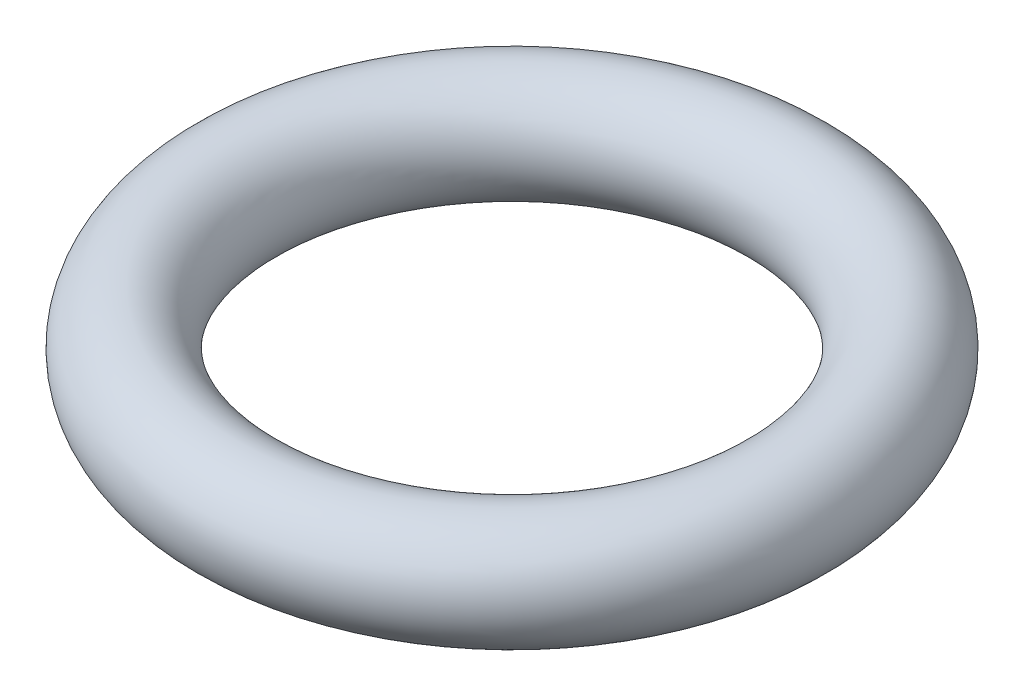
ISO-10303-21;
HEADER;
FILE_DESCRIPTION(('STEP AP214'),'2;1');
FILE_NAME('part.step','',(''),(''),'','','');
FILE_SCHEMA(('AUTOMOTIVE_DESIGN { 1 0 10303 214 1 1 1 1 }'));
ENDSEC;
DATA;
#1=APPLICATION_CONTEXT('core data for automotive mechanical design processes');
#2=APPLICATION_PROTOCOL_DEFINITION('international standard','automotive_design',2000,#1);
#3=PRODUCT_CONTEXT('',#1,'mechanical');
#4=PRODUCT('Part','Part','',(#3));
#5=PRODUCT_RELATED_PRODUCT_CATEGORY('part','',(#4));
#6=PRODUCT_DEFINITION_FORMATION('','',#4);
#7=PRODUCT_DEFINITION_CONTEXT('part definition',#1,'design');
#8=PRODUCT_DEFINITION('design','',#6,#7);
#9=PRODUCT_DEFINITION_SHAPE('','',#8);
#10=(LENGTH_UNIT() NAMED_UNIT(*) SI_UNIT(.MILLI.,.METRE.));
#11=(NAMED_UNIT(*) PLANE_ANGLE_UNIT() SI_UNIT($,.RADIAN.));
#12=(NAMED_UNIT(*) SI_UNIT($,.STERADIAN.) SOLID_ANGLE_UNIT());
#13=UNCERTAINTY_MEASURE_WITH_UNIT(LENGTH_MEASURE(1.E-05),#10,'distance_accuracy_value','');
#14=(GEOMETRIC_REPRESENTATION_CONTEXT(3) GLOBAL_UNCERTAINTY_ASSIGNED_CONTEXT((#13)) GLOBAL_UNIT_ASSIGNED_CONTEXT((#10,
#11,#12)) REPRESENTATION_CONTEXT('',''));
#15=CARTESIAN_POINT('',(0.,0.,0.));
#16=DIRECTION('',(0.,0.,1.));
#17=DIRECTION('',(1.,0.,0.));
#18=AXIS2_PLACEMENT_3D('',#15,#16,#17);
#19=CARTESIAN_POINT('',(0.,0.,0.));
#20=DIRECTION('',(0.,-1.,0.));
#21=DIRECTION('',(0.,0.,-1.));
#22=AXIS2_PLACEMENT_3D('',#19,#20,#21);
#23=TOROIDAL_SURFACE('',#22,5.,1.);
#24=CARTESIAN_POINT('',(0.,0.,-6.));
#25=VERTEX_POINT('',#24);
#26=VERTEX_LOOP('',#25);
#27=FACE_BOUND('',#26,.T.);
#28=ADVANCED_FACE('F35',(#27),#23,.T.);
#29=CLOSED_SHELL('',(#28));
#30=MANIFOLD_SOLID_BREP('B2',#29);
#31=ADVANCED_BREP_SHAPE_REPRESENTATION('',(#18,#30),#14);
#32=SHAPE_DEFINITION_REPRESENTATION(#9,#31);
ENDSEC;
END-ISO-10303-21;
